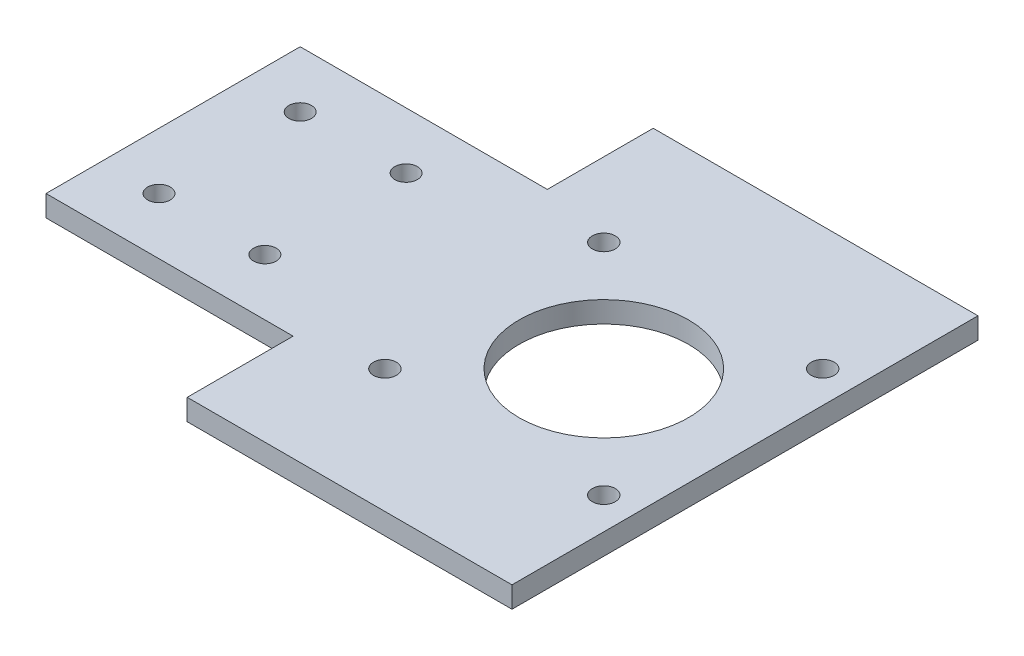
ISO-10303-21;
HEADER;
FILE_DESCRIPTION(('STEP AP214'),'2;1');
FILE_NAME('part.step','',(''),(''),'','','');
FILE_SCHEMA(('AUTOMOTIVE_DESIGN { 1 0 10303 214 1 1 1 1 }'));
ENDSEC;
DATA;
#1=APPLICATION_CONTEXT('core data for automotive mechanical design processes');
#2=APPLICATION_PROTOCOL_DEFINITION('international standard','automotive_design',2000,#1);
#3=PRODUCT_CONTEXT('',#1,'mechanical');
#4=PRODUCT('Part','Part','',(#3));
#5=PRODUCT_RELATED_PRODUCT_CATEGORY('part','',(#4));
#6=PRODUCT_DEFINITION_FORMATION('','',#4);
#7=PRODUCT_DEFINITION_CONTEXT('part definition',#1,'design');
#8=PRODUCT_DEFINITION('design','',#6,#7);
#9=PRODUCT_DEFINITION_SHAPE('','',#8);
#10=(LENGTH_UNIT() NAMED_UNIT(*) SI_UNIT(.MILLI.,.METRE.));
#11=(NAMED_UNIT(*) PLANE_ANGLE_UNIT() SI_UNIT($,.RADIAN.));
#12=(NAMED_UNIT(*) SI_UNIT($,.STERADIAN.) SOLID_ANGLE_UNIT());
#13=UNCERTAINTY_MEASURE_WITH_UNIT(LENGTH_MEASURE(1.E-05),#10,'distance_accuracy_value','');
#14=(GEOMETRIC_REPRESENTATION_CONTEXT(3) GLOBAL_UNCERTAINTY_ASSIGNED_CONTEXT((#13)) GLOBAL_UNIT_ASSIGNED_CONTEXT((#10,
#11,#12)) REPRESENTATION_CONTEXT('',''));
#15=CARTESIAN_POINT('',(0.,0.,0.));
#16=DIRECTION('',(0.,0.,1.));
#17=DIRECTION('',(1.,0.,0.));
#18=AXIS2_PLACEMENT_3D('',#15,#16,#17);
#19=CARTESIAN_POINT('',(35.,3.,0.));
#20=DIRECTION('',(0.,0.,-1.));
#21=DIRECTION('',(-1.,0.,0.));
#22=AXIS2_PLACEMENT_3D('',#19,#20,#21);
#23=PLANE('',#22);
#24=DIRECTION('',(1.,0.,0.));
#25=VECTOR('',#24,1.);
#26=CARTESIAN_POINT('',(35.,0.,0.));
#27=LINE('',#26,#25);
#28=CARTESIAN_POINT('',(0.,0.,0.));
#29=VERTEX_POINT('',#28);
#30=CARTESIAN_POINT('',(35.,0.,0.));
#31=VERTEX_POINT('',#30);
#32=EDGE_CURVE('E131',#29,#31,#27,.T.);
#33=ORIENTED_EDGE('',*,*,#32,.T.);
#34=DIRECTION('',(0.,-1.,0.));
#35=VECTOR('',#34,1.);
#36=CARTESIAN_POINT('',(35.,3.,0.));
#37=LINE('',#36,#35);
#38=CARTESIAN_POINT('',(35.,3.,0.));
#39=VERTEX_POINT('',#38);
#40=EDGE_CURVE('E11',#39,#31,#37,.T.);
#41=ORIENTED_EDGE('',*,*,#40,.F.);
#42=DIRECTION('',(1.,0.,0.));
#43=VECTOR('',#42,1.);
#44=CARTESIAN_POINT('',(35.,3.,0.));
#45=LINE('',#44,#43);
#46=CARTESIAN_POINT('',(0.,3.,0.));
#47=VERTEX_POINT('',#46);
#48=EDGE_CURVE('E146',#47,#39,#45,.T.);
#49=ORIENTED_EDGE('',*,*,#48,.F.);
#50=DIRECTION('',(0.,-1.,0.));
#51=VECTOR('',#50,1.);
#52=CARTESIAN_POINT('',(0.,3.,0.));
#53=LINE('',#52,#51);
#54=EDGE_CURVE('E127',#47,#29,#53,.T.);
#55=ORIENTED_EDGE('',*,*,#54,.T.);
#56=EDGE_LOOP('',(#33,#41,#49,#55));
#57=FACE_BOUND('',#56,.T.);
#58=ADVANCED_FACE('F35',(#57),#23,.F.);
#59=CARTESIAN_POINT('',(35.,3.,15.));
#60=DIRECTION('',(1.,0.,0.));
#61=DIRECTION('',(0.,0.,-1.));
#62=AXIS2_PLACEMENT_3D('',#59,#60,#61);
#63=PLANE('',#62);
#64=DIRECTION('',(0.,0.,1.));
#65=VECTOR('',#64,1.);
#66=CARTESIAN_POINT('',(35.,0.,15.));
#67=LINE('',#66,#65);
#68=CARTESIAN_POINT('',(35.,0.,15.));
#69=VERTEX_POINT('',#68);
#70=EDGE_CURVE('E134',#31,#69,#67,.T.);
#71=ORIENTED_EDGE('',*,*,#70,.T.);
#72=DIRECTION('',(0.,-1.,0.));
#73=VECTOR('',#72,1.);
#74=CARTESIAN_POINT('',(35.,3.,15.));
#75=LINE('',#74,#73);
#76=CARTESIAN_POINT('',(35.,3.,15.));
#77=VERTEX_POINT('',#76);
#78=EDGE_CURVE('E43',#77,#69,#75,.T.);
#79=ORIENTED_EDGE('',*,*,#78,.F.);
#80=DIRECTION('',(0.,0.,1.));
#81=VECTOR('',#80,1.);
#82=CARTESIAN_POINT('',(35.,3.,15.));
#83=LINE('',#82,#81);
#84=EDGE_CURVE('E94',#39,#77,#83,.T.);
#85=ORIENTED_EDGE('',*,*,#84,.F.);
#86=ORIENTED_EDGE('',*,*,#40,.T.);
#87=EDGE_LOOP('',(#71,#79,#85,#86));
#88=FACE_BOUND('',#87,.T.);
#89=ADVANCED_FACE('F276',(#88),#63,.F.);
#90=CARTESIAN_POINT('',(81.,3.,15.));
#91=DIRECTION('',(0.,0.,-1.));
#92=DIRECTION('',(-1.,0.,0.));
#93=AXIS2_PLACEMENT_3D('',#90,#91,#92);
#94=PLANE('',#93);
#95=DIRECTION('',(1.,0.,0.));
#96=VECTOR('',#95,1.);
#97=CARTESIAN_POINT('',(81.,0.,15.));
#98=LINE('',#97,#96);
#99=CARTESIAN_POINT('',(81.,0.,15.));
#100=VERTEX_POINT('',#99);
#101=EDGE_CURVE('E137',#69,#100,#98,.T.);
#102=ORIENTED_EDGE('',*,*,#101,.T.);
#103=DIRECTION('',(0.,-1.,0.));
#104=VECTOR('',#103,1.);
#105=CARTESIAN_POINT('',(81.,3.,15.));
#106=LINE('',#105,#104);
#107=CARTESIAN_POINT('',(81.,3.,15.));
#108=VERTEX_POINT('',#107);
#109=EDGE_CURVE('E153',#108,#100,#106,.T.);
#110=ORIENTED_EDGE('',*,*,#109,.F.);
#111=DIRECTION('',(1.,0.,0.));
#112=VECTOR('',#111,1.);
#113=CARTESIAN_POINT('',(81.,3.,15.));
#114=LINE('',#113,#112);
#115=EDGE_CURVE('E161',#77,#108,#114,.T.);
#116=ORIENTED_EDGE('',*,*,#115,.F.);
#117=ORIENTED_EDGE('',*,*,#78,.T.);
#118=EDGE_LOOP('',(#102,#110,#116,#117));
#119=FACE_BOUND('',#118,.T.);
#120=ADVANCED_FACE('F159',(#119),#94,.F.);
#121=CARTESIAN_POINT('',(81.,3.,-51.));
#122=DIRECTION('',(-1.,0.,0.));
#123=DIRECTION('',(0.,0.,1.));
#124=AXIS2_PLACEMENT_3D('',#121,#122,#123);
#125=PLANE('',#124);
#126=DIRECTION('',(0.,0.,-1.));
#127=VECTOR('',#126,1.);
#128=CARTESIAN_POINT('',(81.,0.,-51.));
#129=LINE('',#128,#127);
#130=CARTESIAN_POINT('',(81.,0.,-51.));
#131=VERTEX_POINT('',#130);
#132=EDGE_CURVE('E139',#100,#131,#129,.T.);
#133=ORIENTED_EDGE('',*,*,#132,.T.);
#134=DIRECTION('',(0.,-1.,0.));
#135=VECTOR('',#134,1.);
#136=CARTESIAN_POINT('',(81.,3.,-51.));
#137=LINE('',#136,#135);
#138=CARTESIAN_POINT('',(81.,3.,-51.));
#139=VERTEX_POINT('',#138);
#140=EDGE_CURVE('E150',#139,#131,#137,.T.);
#141=ORIENTED_EDGE('',*,*,#140,.F.);
#142=DIRECTION('',(0.,0.,-1.));
#143=VECTOR('',#142,1.);
#144=CARTESIAN_POINT('',(81.,3.,-51.));
#145=LINE('',#144,#143);
#146=EDGE_CURVE('E173',#108,#139,#145,.T.);
#147=ORIENTED_EDGE('',*,*,#146,.F.);
#148=ORIENTED_EDGE('',*,*,#109,.T.);
#149=EDGE_LOOP('',(#133,#141,#147,#148));
#150=FACE_BOUND('',#149,.T.);
#151=ADVANCED_FACE('F169',(#150),#125,.F.);
#152=CARTESIAN_POINT('',(35.,3.,-51.));
#153=DIRECTION('',(0.,0.,1.));
#154=DIRECTION('',(1.,0.,0.));
#155=AXIS2_PLACEMENT_3D('',#152,#153,#154);
#156=PLANE('',#155);
#157=DIRECTION('',(-1.,0.,0.));
#158=VECTOR('',#157,1.);
#159=CARTESIAN_POINT('',(35.,0.,-51.));
#160=LINE('',#159,#158);
#161=CARTESIAN_POINT('',(35.,0.,-51.));
#162=VERTEX_POINT('',#161);
#163=EDGE_CURVE('E141',#131,#162,#160,.T.);
#164=ORIENTED_EDGE('',*,*,#163,.T.);
#165=DIRECTION('',(0.,-1.,0.));
#166=VECTOR('',#165,1.);
#167=CARTESIAN_POINT('',(35.,3.,-51.));
#168=LINE('',#167,#166);
#169=CARTESIAN_POINT('',(35.,3.,-51.));
#170=VERTEX_POINT('',#169);
#171=EDGE_CURVE('E122',#170,#162,#168,.T.);
#172=ORIENTED_EDGE('',*,*,#171,.F.);
#173=DIRECTION('',(-1.,0.,0.));
#174=VECTOR('',#173,1.);
#175=CARTESIAN_POINT('',(35.,3.,-51.));
#176=LINE('',#175,#174);
#177=EDGE_CURVE('E113',#139,#170,#176,.T.);
#178=ORIENTED_EDGE('',*,*,#177,.F.);
#179=ORIENTED_EDGE('',*,*,#140,.T.);
#180=EDGE_LOOP('',(#164,#172,#178,#179));
#181=FACE_BOUND('',#180,.T.);
#182=ADVANCED_FACE('F172',(#181),#156,.F.);
#183=CARTESIAN_POINT('',(35.,3.,-36.));
#184=DIRECTION('',(1.,0.,0.));
#185=DIRECTION('',(0.,0.,-1.));
#186=AXIS2_PLACEMENT_3D('',#183,#184,#185);
#187=PLANE('',#186);
#188=DIRECTION('',(0.,0.,1.));
#189=VECTOR('',#188,1.);
#190=CARTESIAN_POINT('',(35.,0.,-36.));
#191=LINE('',#190,#189);
#192=CARTESIAN_POINT('',(35.,0.,-36.));
#193=VERTEX_POINT('',#192);
#194=EDGE_CURVE('E121',#162,#193,#191,.T.);
#195=ORIENTED_EDGE('',*,*,#194,.T.);
#196=DIRECTION('',(0.,-1.,0.));
#197=VECTOR('',#196,1.);
#198=CARTESIAN_POINT('',(35.,3.,-36.));
#199=LINE('',#198,#197);
#200=CARTESIAN_POINT('',(35.,3.,-36.));
#201=VERTEX_POINT('',#200);
#202=EDGE_CURVE('E118',#201,#193,#199,.T.);
#203=ORIENTED_EDGE('',*,*,#202,.F.);
#204=DIRECTION('',(0.,0.,1.));
#205=VECTOR('',#204,1.);
#206=CARTESIAN_POINT('',(35.,3.,-36.));
#207=LINE('',#206,#205);
#208=EDGE_CURVE('E107',#170,#201,#207,.T.);
#209=ORIENTED_EDGE('',*,*,#208,.F.);
#210=ORIENTED_EDGE('',*,*,#171,.T.);
#211=EDGE_LOOP('',(#195,#203,#209,#210));
#212=FACE_BOUND('',#211,.T.);
#213=ADVANCED_FACE('F119',(#212),#187,.F.);
#214=CARTESIAN_POINT('',(0.,3.,-36.));
#215=DIRECTION('',(0.,0.,1.));
#216=DIRECTION('',(1.,0.,0.));
#217=AXIS2_PLACEMENT_3D('',#214,#215,#216);
#218=PLANE('',#217);
#219=DIRECTION('',(-1.,0.,0.));
#220=VECTOR('',#219,1.);
#221=CARTESIAN_POINT('',(0.,0.,-36.));
#222=LINE('',#221,#220);
#223=CARTESIAN_POINT('',(0.,0.,-36.));
#224=VERTEX_POINT('',#223);
#225=EDGE_CURVE('E80',#193,#224,#222,.T.);
#226=ORIENTED_EDGE('',*,*,#225,.T.);
#227=DIRECTION('',(0.,-1.,0.));
#228=VECTOR('',#227,1.);
#229=CARTESIAN_POINT('',(0.,3.,-36.));
#230=LINE('',#229,#228);
#231=CARTESIAN_POINT('',(0.,3.,-36.));
#232=VERTEX_POINT('',#231);
#233=EDGE_CURVE('E123',#232,#224,#230,.T.);
#234=ORIENTED_EDGE('',*,*,#233,.F.);
#235=DIRECTION('',(-1.,0.,0.));
#236=VECTOR('',#235,1.);
#237=CARTESIAN_POINT('',(0.,3.,-36.));
#238=LINE('',#237,#236);
#239=EDGE_CURVE('E111',#201,#232,#238,.T.);
#240=ORIENTED_EDGE('',*,*,#239,.F.);
#241=ORIENTED_EDGE('',*,*,#202,.T.);
#242=EDGE_LOOP('',(#226,#234,#240,#241));
#243=FACE_BOUND('',#242,.T.);
#244=ADVANCED_FACE('F125',(#243),#218,.F.);
#245=CARTESIAN_POINT('',(0.,3.,0.));
#246=DIRECTION('',(1.,0.,0.));
#247=DIRECTION('',(0.,0.,-1.));
#248=AXIS2_PLACEMENT_3D('',#245,#246,#247);
#249=PLANE('',#248);
#250=DIRECTION('',(0.,0.,1.));
#251=VECTOR('',#250,1.);
#252=CARTESIAN_POINT('',(0.,0.,0.));
#253=LINE('',#252,#251);
#254=EDGE_CURVE('E86',#224,#29,#253,.T.);
#255=ORIENTED_EDGE('',*,*,#254,.T.);
#256=ORIENTED_EDGE('',*,*,#54,.F.);
#257=DIRECTION('',(0.,0.,1.));
#258=VECTOR('',#257,1.);
#259=CARTESIAN_POINT('',(0.,3.,0.));
#260=LINE('',#259,#258);
#261=EDGE_CURVE('E51',#232,#47,#260,.T.);
#262=ORIENTED_EDGE('',*,*,#261,.F.);
#263=ORIENTED_EDGE('',*,*,#233,.T.);
#264=EDGE_LOOP('',(#255,#256,#262,#263));
#265=FACE_BOUND('',#264,.T.);
#266=ADVANCED_FACE('F267',(#265),#249,.F.);
#267=CARTESIAN_POINT('',(0.,3.,0.));
#268=DIRECTION('',(0.,-1.,0.));
#269=DIRECTION('',(0.,0.,-1.));
#270=AXIS2_PLACEMENT_3D('',#267,#268,#269);
#271=PLANE('',#270);
#272=CARTESIAN_POINT('',(45.5,3.,-2.49999999999969));
#273=DIRECTION('',(0.,-1.,0.));
#274=DIRECTION('',(0.,0.,-1.));
#275=AXIS2_PLACEMENT_3D('',#272,#273,#274);
#276=CIRCLE('',#275,1.62500000000026);
#277=CARTESIAN_POINT('',(45.5,3.,-4.12499999999995));
#278=VERTEX_POINT('',#277);
#279=EDGE_CURVE('E218',#278,#278,#276,.T.);
#280=ORIENTED_EDGE('',*,*,#279,.T.);
#281=EDGE_LOOP('',(#280));
#282=FACE_BOUND('',#281,.T.);
#283=CARTESIAN_POINT('',(76.5,3.,-2.4999999999997));
#284=DIRECTION('',(0.,-1.,0.));
#285=DIRECTION('',(0.,0.,-1.));
#286=AXIS2_PLACEMENT_3D('',#283,#284,#285);
#287=CIRCLE('',#286,1.62500000000026);
#288=CARTESIAN_POINT('',(76.5,3.,-4.12499999999996));
#289=VERTEX_POINT('',#288);
#290=EDGE_CURVE('E224',#289,#289,#287,.T.);
#291=ORIENTED_EDGE('',*,*,#290,.T.);
#292=EDGE_LOOP('',(#291));
#293=FACE_BOUND('',#292,.T.);
#294=CARTESIAN_POINT('',(76.5,3.,-33.4999999999997));
#295=DIRECTION('',(0.,-1.,0.));
#296=DIRECTION('',(0.,0.,-1.));
#297=AXIS2_PLACEMENT_3D('',#294,#295,#296);
#298=CIRCLE('',#297,1.62500000000026);
#299=CARTESIAN_POINT('',(76.5,3.,-35.125));
#300=VERTEX_POINT('',#299);
#301=EDGE_CURVE('E212',#300,#300,#298,.T.);
#302=ORIENTED_EDGE('',*,*,#301,.T.);
#303=EDGE_LOOP('',(#302));
#304=FACE_BOUND('',#303,.T.);
#305=CARTESIAN_POINT('',(45.5,3.,-33.4999999999997));
#306=DIRECTION('',(0.,-1.,0.));
#307=DIRECTION('',(0.,0.,-1.));
#308=AXIS2_PLACEMENT_3D('',#305,#306,#307);
#309=CIRCLE('',#308,1.62500000000026);
#310=CARTESIAN_POINT('',(45.5,3.,-35.125));
#311=VERTEX_POINT('',#310);
#312=EDGE_CURVE('E201',#311,#311,#309,.T.);
#313=ORIENTED_EDGE('',*,*,#312,.T.);
#314=EDGE_LOOP('',(#313));
#315=FACE_BOUND('',#314,.T.);
#316=CARTESIAN_POINT('',(23.,3.,-28.));
#317=DIRECTION('',(0.,1.,0.));
#318=DIRECTION('',(0.,0.,1.));
#319=AXIS2_PLACEMENT_3D('',#316,#317,#318);
#320=CIRCLE('',#319,1.6);
#321=CARTESIAN_POINT('',(23.,3.,-26.4));
#322=VERTEX_POINT('',#321);
#323=EDGE_CURVE('E192',#322,#322,#320,.T.);
#324=ORIENTED_EDGE('',*,*,#323,.F.);
#325=EDGE_LOOP('',(#324));
#326=FACE_BOUND('',#325,.T.);
#327=CARTESIAN_POINT('',(8.,3.,-8.));
#328=DIRECTION('',(0.,1.,0.));
#329=DIRECTION('',(0.,0.,1.));
#330=AXIS2_PLACEMENT_3D('',#327,#328,#329);
#331=CIRCLE('',#330,1.6);
#332=CARTESIAN_POINT('',(8.,3.,-6.4));
#333=VERTEX_POINT('',#332);
#334=EDGE_CURVE('E185',#333,#333,#331,.T.);
#335=ORIENTED_EDGE('',*,*,#334,.F.);
#336=EDGE_LOOP('',(#335));
#337=FACE_BOUND('',#336,.T.);
#338=CARTESIAN_POINT('',(23.,3.,-8.));
#339=DIRECTION('',(0.,1.,0.));
#340=DIRECTION('',(0.,0.,1.));
#341=AXIS2_PLACEMENT_3D('',#338,#339,#340);
#342=CIRCLE('',#341,1.6);
#343=CARTESIAN_POINT('',(23.,3.,-6.4));
#344=VERTEX_POINT('',#343);
#345=EDGE_CURVE('E204',#344,#344,#342,.T.);
#346=ORIENTED_EDGE('',*,*,#345,.F.);
#347=EDGE_LOOP('',(#346));
#348=FACE_BOUND('',#347,.T.);
#349=CARTESIAN_POINT('',(61.,3.,-18.));
#350=DIRECTION('',(0.,1.,0.));
#351=DIRECTION('',(0.,0.,1.));
#352=AXIS2_PLACEMENT_3D('',#349,#350,#351);
#353=CIRCLE('',#352,12.);
#354=CARTESIAN_POINT('',(61.,3.,-6.));
#355=VERTEX_POINT('',#354);
#356=EDGE_CURVE('E197',#355,#355,#353,.T.);
#357=ORIENTED_EDGE('',*,*,#356,.F.);
#358=EDGE_LOOP('',(#357));
#359=FACE_BOUND('',#358,.T.);
#360=CARTESIAN_POINT('',(8.,3.,-28.));
#361=DIRECTION('',(0.,1.,0.));
#362=DIRECTION('',(0.,0.,1.));
#363=AXIS2_PLACEMENT_3D('',#360,#361,#362);
#364=CIRCLE('',#363,1.6);
#365=CARTESIAN_POINT('',(8.,3.,-26.4));
#366=VERTEX_POINT('',#365);
#367=EDGE_CURVE('E179',#366,#366,#364,.T.);
#368=ORIENTED_EDGE('',*,*,#367,.F.);
#369=EDGE_LOOP('',(#368));
#370=FACE_BOUND('',#369,.T.);
#371=ORIENTED_EDGE('',*,*,#48,.T.);
#372=ORIENTED_EDGE('',*,*,#84,.T.);
#373=ORIENTED_EDGE('',*,*,#115,.T.);
#374=ORIENTED_EDGE('',*,*,#146,.T.);
#375=ORIENTED_EDGE('',*,*,#177,.T.);
#376=ORIENTED_EDGE('',*,*,#208,.T.);
#377=ORIENTED_EDGE('',*,*,#239,.T.);
#378=ORIENTED_EDGE('',*,*,#261,.T.);
#379=EDGE_LOOP('',(#371,#372,#373,#374,#375,#376,#377,#378));
#380=FACE_BOUND('',#379,.T.);
#381=ADVANCED_FACE('F109',(#282,#293,#304,#315,#326,#337,#348,#359,#370,#380),#271,.F.);
#382=CARTESIAN_POINT('',(0.,0.,0.));
#383=DIRECTION('',(0.,-1.,0.));
#384=DIRECTION('',(0.,0.,-1.));
#385=AXIS2_PLACEMENT_3D('',#382,#383,#384);
#386=PLANE('',#385);
#387=CARTESIAN_POINT('',(45.5,0.,-2.49999999999969));
#388=DIRECTION('',(0.,-1.,0.));
#389=DIRECTION('',(0.,0.,-1.));
#390=AXIS2_PLACEMENT_3D('',#387,#388,#389);
#391=CIRCLE('',#390,1.62500000000026);
#392=CARTESIAN_POINT('',(45.5,0.,-4.12499999999995));
#393=VERTEX_POINT('',#392);
#394=EDGE_CURVE('E215',#393,#393,#391,.T.);
#395=ORIENTED_EDGE('',*,*,#394,.F.);
#396=EDGE_LOOP('',(#395));
#397=FACE_BOUND('',#396,.T.);
#398=CARTESIAN_POINT('',(76.5,0.,-2.4999999999997));
#399=DIRECTION('',(0.,-1.,0.));
#400=DIRECTION('',(0.,0.,-1.));
#401=AXIS2_PLACEMENT_3D('',#398,#399,#400);
#402=CIRCLE('',#401,1.62500000000026);
#403=CARTESIAN_POINT('',(76.5,0.,-4.12499999999996));
#404=VERTEX_POINT('',#403);
#405=EDGE_CURVE('E221',#404,#404,#402,.T.);
#406=ORIENTED_EDGE('',*,*,#405,.F.);
#407=EDGE_LOOP('',(#406));
#408=FACE_BOUND('',#407,.T.);
#409=CARTESIAN_POINT('',(76.5,0.,-33.4999999999997));
#410=DIRECTION('',(0.,-1.,0.));
#411=DIRECTION('',(0.,0.,-1.));
#412=AXIS2_PLACEMENT_3D('',#409,#410,#411);
#413=CIRCLE('',#412,1.62500000000026);
#414=CARTESIAN_POINT('',(76.5,0.,-35.125));
#415=VERTEX_POINT('',#414);
#416=EDGE_CURVE('E227',#415,#415,#413,.T.);
#417=ORIENTED_EDGE('',*,*,#416,.F.);
#418=EDGE_LOOP('',(#417));
#419=FACE_BOUND('',#418,.T.);
#420=CARTESIAN_POINT('',(45.5,0.,-33.4999999999997));
#421=DIRECTION('',(0.,-1.,0.));
#422=DIRECTION('',(0.,0.,-1.));
#423=AXIS2_PLACEMENT_3D('',#420,#421,#422);
#424=CIRCLE('',#423,1.62500000000026);
#425=CARTESIAN_POINT('',(45.5,0.,-35.125));
#426=VERTEX_POINT('',#425);
#427=EDGE_CURVE('E209',#426,#426,#424,.T.);
#428=ORIENTED_EDGE('',*,*,#427,.F.);
#429=EDGE_LOOP('',(#428));
#430=FACE_BOUND('',#429,.T.);
#431=CARTESIAN_POINT('',(23.,0.,-28.));
#432=DIRECTION('',(0.,1.,0.));
#433=DIRECTION('',(0.,0.,1.));
#434=AXIS2_PLACEMENT_3D('',#431,#432,#433);
#435=CIRCLE('',#434,1.6);
#436=CARTESIAN_POINT('',(23.,0.,-26.4));
#437=VERTEX_POINT('',#436);
#438=EDGE_CURVE('E182',#437,#437,#435,.T.);
#439=ORIENTED_EDGE('',*,*,#438,.T.);
#440=EDGE_LOOP('',(#439));
#441=FACE_BOUND('',#440,.T.);
#442=CARTESIAN_POINT('',(8.,0.,-8.));
#443=DIRECTION('',(0.,1.,0.));
#444=DIRECTION('',(0.,0.,1.));
#445=AXIS2_PLACEMENT_3D('',#442,#443,#444);
#446=CIRCLE('',#445,1.6);
#447=CARTESIAN_POINT('',(8.,0.,-6.4));
#448=VERTEX_POINT('',#447);
#449=EDGE_CURVE('E188',#448,#448,#446,.T.);
#450=ORIENTED_EDGE('',*,*,#449,.T.);
#451=EDGE_LOOP('',(#450));
#452=FACE_BOUND('',#451,.T.);
#453=CARTESIAN_POINT('',(23.,0.,-8.));
#454=DIRECTION('',(0.,1.,0.));
#455=DIRECTION('',(0.,0.,1.));
#456=AXIS2_PLACEMENT_3D('',#453,#454,#455);
#457=CIRCLE('',#456,1.6);
#458=CARTESIAN_POINT('',(23.,0.,-6.4));
#459=VERTEX_POINT('',#458);
#460=EDGE_CURVE('E189',#459,#459,#457,.T.);
#461=ORIENTED_EDGE('',*,*,#460,.T.);
#462=EDGE_LOOP('',(#461));
#463=FACE_BOUND('',#462,.T.);
#464=CARTESIAN_POINT('',(61.,0.,-18.));
#465=DIRECTION('',(0.,1.,0.));
#466=DIRECTION('',(0.,0.,1.));
#467=AXIS2_PLACEMENT_3D('',#464,#465,#466);
#468=CIRCLE('',#467,12.);
#469=CARTESIAN_POINT('',(61.,0.,-6.));
#470=VERTEX_POINT('',#469);
#471=EDGE_CURVE('E200',#470,#470,#468,.T.);
#472=ORIENTED_EDGE('',*,*,#471,.T.);
#473=EDGE_LOOP('',(#472));
#474=FACE_BOUND('',#473,.T.);
#475=CARTESIAN_POINT('',(8.,0.,-28.));
#476=DIRECTION('',(0.,1.,0.));
#477=DIRECTION('',(0.,0.,1.));
#478=AXIS2_PLACEMENT_3D('',#475,#476,#477);
#479=CIRCLE('',#478,1.6);
#480=CARTESIAN_POINT('',(8.,0.,-26.4));
#481=VERTEX_POINT('',#480);
#482=EDGE_CURVE('E135',#481,#481,#479,.T.);
#483=ORIENTED_EDGE('',*,*,#482,.T.);
#484=EDGE_LOOP('',(#483));
#485=FACE_BOUND('',#484,.T.);
#486=ORIENTED_EDGE('',*,*,#32,.F.);
#487=ORIENTED_EDGE('',*,*,#254,.F.);
#488=ORIENTED_EDGE('',*,*,#225,.F.);
#489=ORIENTED_EDGE('',*,*,#194,.F.);
#490=ORIENTED_EDGE('',*,*,#163,.F.);
#491=ORIENTED_EDGE('',*,*,#132,.F.);
#492=ORIENTED_EDGE('',*,*,#101,.F.);
#493=ORIENTED_EDGE('',*,*,#70,.F.);
#494=EDGE_LOOP('',(#486,#487,#488,#489,#490,#491,#492,#493));
#495=FACE_BOUND('',#494,.T.);
#496=ADVANCED_FACE('F165',(#397,#408,#419,#430,#441,#452,#463,#474,#485,#495),#386,.T.);
#497=CARTESIAN_POINT('',(8.,0.,-28.));
#498=DIRECTION('',(0.,1.,0.));
#499=DIRECTION('',(0.,0.,1.));
#500=AXIS2_PLACEMENT_3D('',#497,#498,#499);
#501=CYLINDRICAL_SURFACE('',#500,1.6);
#502=ORIENTED_EDGE('',*,*,#482,.F.);
#503=EDGE_LOOP('',(#502));
#504=FACE_BOUND('',#503,.T.);
#505=ORIENTED_EDGE('',*,*,#367,.T.);
#506=EDGE_LOOP('',(#505));
#507=FACE_BOUND('',#506,.T.);
#508=ADVANCED_FACE('F245',(#504,#507),#501,.F.);
#509=CARTESIAN_POINT('',(61.,0.,-18.));
#510=DIRECTION('',(0.,1.,0.));
#511=DIRECTION('',(0.,0.,1.));
#512=AXIS2_PLACEMENT_3D('',#509,#510,#511);
#513=CYLINDRICAL_SURFACE('',#512,12.);
#514=ORIENTED_EDGE('',*,*,#471,.F.);
#515=EDGE_LOOP('',(#514));
#516=FACE_BOUND('',#515,.T.);
#517=ORIENTED_EDGE('',*,*,#356,.T.);
#518=EDGE_LOOP('',(#517));
#519=FACE_BOUND('',#518,.T.);
#520=ADVANCED_FACE('F262',(#516,#519),#513,.F.);
#521=CARTESIAN_POINT('',(23.,0.,-8.));
#522=DIRECTION('',(0.,1.,0.));
#523=DIRECTION('',(0.,0.,1.));
#524=AXIS2_PLACEMENT_3D('',#521,#522,#523);
#525=CYLINDRICAL_SURFACE('',#524,1.6);
#526=ORIENTED_EDGE('',*,*,#460,.F.);
#527=EDGE_LOOP('',(#526));
#528=FACE_BOUND('',#527,.T.);
#529=ORIENTED_EDGE('',*,*,#345,.T.);
#530=EDGE_LOOP('',(#529));
#531=FACE_BOUND('',#530,.T.);
#532=ADVANCED_FACE('F320',(#528,#531),#525,.F.);
#533=CARTESIAN_POINT('',(8.,0.,-8.));
#534=DIRECTION('',(0.,1.,0.));
#535=DIRECTION('',(0.,0.,1.));
#536=AXIS2_PLACEMENT_3D('',#533,#534,#535);
#537=CYLINDRICAL_SURFACE('',#536,1.6);
#538=ORIENTED_EDGE('',*,*,#449,.F.);
#539=EDGE_LOOP('',(#538));
#540=FACE_BOUND('',#539,.T.);
#541=ORIENTED_EDGE('',*,*,#334,.T.);
#542=EDGE_LOOP('',(#541));
#543=FACE_BOUND('',#542,.T.);
#544=ADVANCED_FACE('F330',(#540,#543),#537,.F.);
#545=CARTESIAN_POINT('',(23.,0.,-28.));
#546=DIRECTION('',(0.,1.,0.));
#547=DIRECTION('',(0.,0.,1.));
#548=AXIS2_PLACEMENT_3D('',#545,#546,#547);
#549=CYLINDRICAL_SURFACE('',#548,1.6);
#550=ORIENTED_EDGE('',*,*,#438,.F.);
#551=EDGE_LOOP('',(#550));
#552=FACE_BOUND('',#551,.T.);
#553=ORIENTED_EDGE('',*,*,#323,.T.);
#554=EDGE_LOOP('',(#553));
#555=FACE_BOUND('',#554,.T.);
#556=ADVANCED_FACE('F340',(#552,#555),#549,.F.);
#557=CARTESIAN_POINT('',(45.5,3.,-33.4999999999997));
#558=DIRECTION('',(0.,-1.,0.));
#559=DIRECTION('',(0.,0.,-1.));
#560=AXIS2_PLACEMENT_3D('',#557,#558,#559);
#561=CYLINDRICAL_SURFACE('',#560,1.62500000000026);
#562=ORIENTED_EDGE('',*,*,#312,.F.);
#563=EDGE_LOOP('',(#562));
#564=FACE_BOUND('',#563,.T.);
#565=ORIENTED_EDGE('',*,*,#427,.T.);
#566=EDGE_LOOP('',(#565));
#567=FACE_BOUND('',#566,.T.);
#568=ADVANCED_FACE('F239',(#564,#567),#561,.F.);
#569=CARTESIAN_POINT('',(76.5,3.,-33.4999999999997));
#570=DIRECTION('',(0.,-1.,0.));
#571=DIRECTION('',(0.,0.,-1.));
#572=AXIS2_PLACEMENT_3D('',#569,#570,#571);
#573=CYLINDRICAL_SURFACE('',#572,1.62500000000026);
#574=ORIENTED_EDGE('',*,*,#301,.F.);
#575=EDGE_LOOP('',(#574));
#576=FACE_BOUND('',#575,.T.);
#577=ORIENTED_EDGE('',*,*,#416,.T.);
#578=EDGE_LOOP('',(#577));
#579=FACE_BOUND('',#578,.T.);
#580=ADVANCED_FACE('F235',(#576,#579),#573,.F.);
#581=CARTESIAN_POINT('',(76.5,3.,-2.4999999999997));
#582=DIRECTION('',(0.,-1.,0.));
#583=DIRECTION('',(0.,0.,-1.));
#584=AXIS2_PLACEMENT_3D('',#581,#582,#583);
#585=CYLINDRICAL_SURFACE('',#584,1.62500000000026);
#586=ORIENTED_EDGE('',*,*,#290,.F.);
#587=EDGE_LOOP('',(#586));
#588=FACE_BOUND('',#587,.T.);
#589=ORIENTED_EDGE('',*,*,#405,.T.);
#590=EDGE_LOOP('',(#589));
#591=FACE_BOUND('',#590,.T.);
#592=ADVANCED_FACE('F238',(#588,#591),#585,.F.);
#593=CARTESIAN_POINT('',(45.5,3.,-2.49999999999969));
#594=DIRECTION('',(0.,-1.,0.));
#595=DIRECTION('',(0.,0.,-1.));
#596=AXIS2_PLACEMENT_3D('',#593,#594,#595);
#597=CYLINDRICAL_SURFACE('',#596,1.62500000000026);
#598=ORIENTED_EDGE('',*,*,#279,.F.);
#599=EDGE_LOOP('',(#598));
#600=FACE_BOUND('',#599,.T.);
#601=ORIENTED_EDGE('',*,*,#394,.T.);
#602=EDGE_LOOP('',(#601));
#603=FACE_BOUND('',#602,.T.);
#604=ADVANCED_FACE('F382',(#600,#603),#597,.F.);
#605=CLOSED_SHELL('',(#58,#89,#120,#151,#182,#213,#244,#266,#381,#496,#508,#520,#532,#544,#556,
#568,#580,#592,#604));
#606=MANIFOLD_SOLID_BREP('B2',#605);
#607=ADVANCED_BREP_SHAPE_REPRESENTATION('',(#18,#606),#14);
#608=SHAPE_DEFINITION_REPRESENTATION(#9,#607);
ENDSEC;
END-ISO-10303-21;
